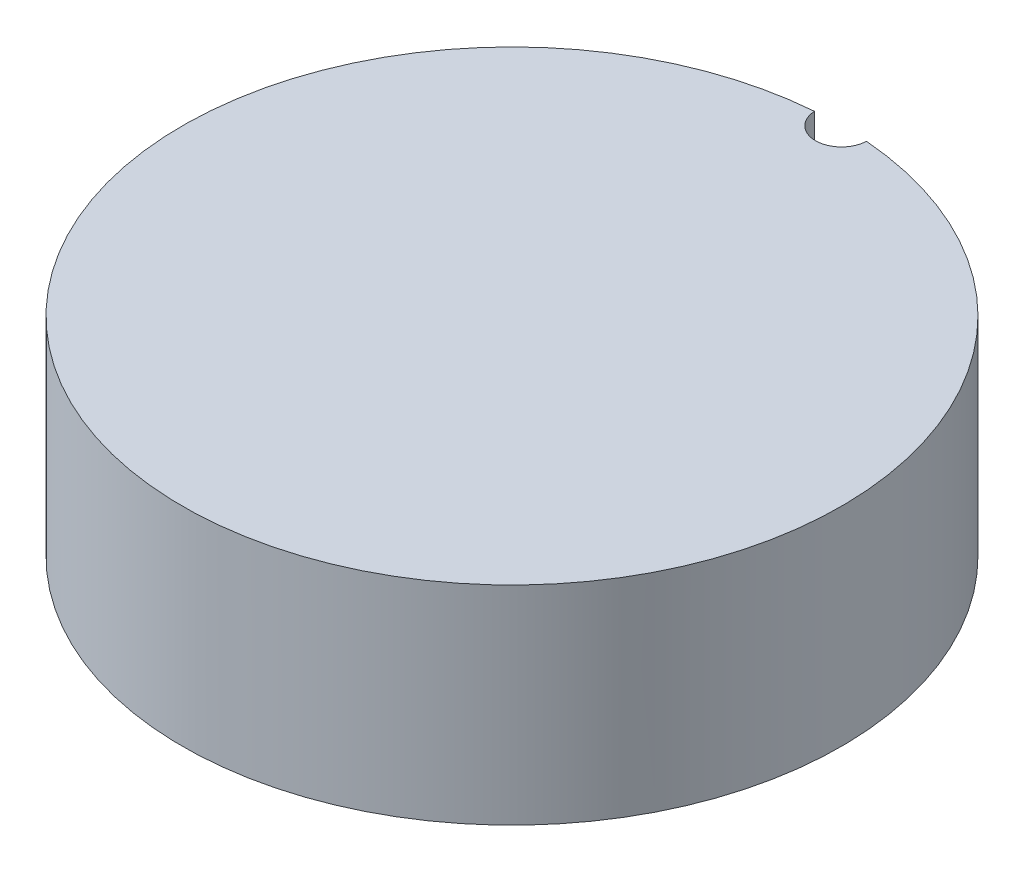
ISO-10303-21;
HEADER;
FILE_DESCRIPTION(('STEP AP214'),'2;1');
FILE_NAME('part.step','',(''),(''),'','','');
FILE_SCHEMA(('AUTOMOTIVE_DESIGN { 1 0 10303 214 1 1 1 1 }'));
ENDSEC;
DATA;
#1=APPLICATION_CONTEXT('core data for automotive mechanical design processes');
#2=APPLICATION_PROTOCOL_DEFINITION('international standard','automotive_design',2000,#1);
#3=PRODUCT_CONTEXT('',#1,'mechanical');
#4=PRODUCT('Part','Part','',(#3));
#5=PRODUCT_RELATED_PRODUCT_CATEGORY('part','',(#4));
#6=PRODUCT_DEFINITION_FORMATION('','',#4);
#7=PRODUCT_DEFINITION_CONTEXT('part definition',#1,'design');
#8=PRODUCT_DEFINITION('design','',#6,#7);
#9=PRODUCT_DEFINITION_SHAPE('','',#8);
#10=(LENGTH_UNIT() NAMED_UNIT(*) SI_UNIT(.MILLI.,.METRE.));
#11=(NAMED_UNIT(*) PLANE_ANGLE_UNIT() SI_UNIT($,.RADIAN.));
#12=(NAMED_UNIT(*) SI_UNIT($,.STERADIAN.) SOLID_ANGLE_UNIT());
#13=UNCERTAINTY_MEASURE_WITH_UNIT(LENGTH_MEASURE(1.E-05),#10,'distance_accuracy_value','');
#14=(GEOMETRIC_REPRESENTATION_CONTEXT(3) GLOBAL_UNCERTAINTY_ASSIGNED_CONTEXT((#13)) GLOBAL_UNIT_ASSIGNED_CONTEXT((#10,
#11,#12)) REPRESENTATION_CONTEXT('',''));
#15=CARTESIAN_POINT('',(0.,0.,0.));
#16=DIRECTION('',(0.,0.,1.));
#17=DIRECTION('',(1.,0.,0.));
#18=AXIS2_PLACEMENT_3D('',#15,#16,#17);
#19=CARTESIAN_POINT('',(-31.685,0.,0.));
#20=DIRECTION('',(0.,1.,0.));
#21=DIRECTION('',(-1.,0.,0.));
#22=AXIS2_PLACEMENT_3D('',#19,#20,#21);
#23=PLANE('',#22);
#24=CARTESIAN_POINT('',(0.,0.,-31.685));
#25=DIRECTION('',(0.,1.,0.));
#26=DIRECTION('',(-1.,0.,0.));
#27=AXIS2_PLACEMENT_3D('',#24,#25,#26);
#28=CIRCLE('',#27,2.5);
#29=CARTESIAN_POINT('',(-2.49805378105651,0.,-31.5863728893798));
#30=VERTEX_POINT('',#29);
#31=CARTESIAN_POINT('',(2.49805378105651,0.,-31.5863728893798));
#32=VERTEX_POINT('',#31);
#33=EDGE_CURVE('E87',#30,#32,#28,.T.);
#34=ORIENTED_EDGE('',*,*,#33,.F.);
#35=CARTESIAN_POINT('',(0.,0.,0.));
#36=DIRECTION('',(0.,1.,0.));
#37=DIRECTION('',(-1.,0.,0.));
#38=AXIS2_PLACEMENT_3D('',#35,#36,#37);
#39=CIRCLE('',#38,31.685);
#40=EDGE_CURVE('E52',#30,#32,#39,.T.);
#41=ORIENTED_EDGE('',*,*,#40,.T.);
#42=EDGE_LOOP('',(#34,#41));
#43=FACE_BOUND('',#42,.T.);
#44=ADVANCED_FACE('F38',(#43),#23,.T.);
#45=CARTESIAN_POINT('',(0.,0.,0.));
#46=DIRECTION('',(0.,1.,0.));
#47=DIRECTION('',(-1.,0.,0.));
#48=AXIS2_PLACEMENT_3D('',#45,#46,#47);
#49=CYLINDRICAL_SURFACE('',#48,31.685);
#50=DIRECTION('',(0.,1.,0.));
#51=VECTOR('',#50,1.);
#52=CARTESIAN_POINT('',(-2.49805378105651,-20.,-31.5863728893798));
#53=LINE('',#52,#51);
#54=CARTESIAN_POINT('',(-2.49805378105651,-20.,-31.5863728893798));
#55=VERTEX_POINT('',#54);
#56=EDGE_CURVE('E63',#55,#30,#53,.T.);
#57=ORIENTED_EDGE('',*,*,#56,.F.);
#58=CARTESIAN_POINT('',(0.,-20.,0.));
#59=DIRECTION('',(0.,1.,0.));
#60=DIRECTION('',(-1.,0.,0.));
#61=AXIS2_PLACEMENT_3D('',#58,#59,#60);
#62=CIRCLE('',#61,31.685);
#63=CARTESIAN_POINT('',(2.49805378105651,-20.,-31.5863728893798));
#64=VERTEX_POINT('',#63);
#65=EDGE_CURVE('E75',#55,#64,#62,.T.);
#66=ORIENTED_EDGE('',*,*,#65,.T.);
#67=DIRECTION('',(0.,1.,0.));
#68=VECTOR('',#67,1.);
#69=CARTESIAN_POINT('',(2.49805378105651,-20.,-31.5863728893798));
#70=LINE('',#69,#68);
#71=EDGE_CURVE('E58',#64,#32,#70,.T.);
#72=ORIENTED_EDGE('',*,*,#71,.T.);
#73=ORIENTED_EDGE('',*,*,#40,.F.);
#74=EDGE_LOOP('',(#57,#66,#72,#73));
#75=FACE_BOUND('',#74,.T.);
#76=ADVANCED_FACE('F74',(#75),#49,.T.);
#77=CARTESIAN_POINT('',(0.,-20.,0.));
#78=DIRECTION('',(0.,1.,0.));
#79=DIRECTION('',(-1.,0.,0.));
#80=AXIS2_PLACEMENT_3D('',#77,#78,#79);
#81=TOROIDAL_SURFACE('',#80,21.685,10.);
#82=CARTESIAN_POINT('',(2.49805378097755,-20.0002,-31.5863728873798));
#83=CARTESIAN_POINT('',(2.49803226030124,-19.8609735334104,-31.5863792021508));
#84=CARTESIAN_POINT('',(2.49793846335794,-19.7217473724363,-31.5834709830961));
#85=CARTESIAN_POINT('',(2.49745073847929,-19.4435366054167,-31.57185082952));
#86=CARTESIAN_POINT('',(2.49705680768542,-19.3045520016844,-31.5631388397228));
#87=CARTESIAN_POINT('',(2.49581240813705,-19.026884316439,-31.5399211424883));
#88=CARTESIAN_POINT('',(2.49496133580313,-18.8882018775043,-31.525407781801));
#89=CARTESIAN_POINT('',(2.49249456523227,-18.6115670080552,-31.4906379339553));
#90=CARTESIAN_POINT('',(2.49087887531485,-18.4736145696145,-31.4703815092861));
#91=CARTESIAN_POINT('',(2.48645241483846,-18.1977742458198,-31.4240417405312));
#92=CARTESIAN_POINT('',(2.48363383276224,-18.0598927866746,-31.3979208478406));
#93=CARTESIAN_POINT('',(2.47625564376228,-17.7853702714661,-31.3400218915293));
#94=CARTESIAN_POINT('',(2.47169606529032,-17.6487291951696,-31.3082439203625));
#95=CARTESIAN_POINT('',(2.46017611889462,-17.3770662129406,-31.2391767464367));
#96=CARTESIAN_POINT('',(2.45321773410301,-17.2420430645542,-31.2018921106344));
#97=CARTESIAN_POINT('',(2.43611268679312,-16.9738183365467,-31.1219491847869));
#98=CARTESIAN_POINT('',(2.42596652709255,-16.840616473104,-31.0792917428464));
#99=CARTESIAN_POINT('',(2.40196186054151,-16.5806905909418,-30.9902814662674));
#100=CARTESIAN_POINT('',(2.38823596404355,-16.4538973665585,-30.9440956288559));
#101=CARTESIAN_POINT('',(2.35596553118701,-16.2026986513739,-30.8471225076173));
#102=CARTESIAN_POINT('',(2.33742118962567,-16.0782930642649,-30.7963354098614));
#103=CARTESIAN_POINT('',(2.29441980940415,-15.8325145140031,-30.6905690101038));
#104=CARTESIAN_POINT('',(2.2699711272399,-15.7111375299491,-30.6355957075246));
#105=CARTESIAN_POINT('',(2.2138556683929,-15.471863179446,-30.5218724247385));
#106=CARTESIAN_POINT('',(2.18219030667878,-15.3539651359953,-30.4631231864954));
#107=CARTESIAN_POINT('',(2.11797969824251,-15.1476325417017,-30.3556470743587));
#108=CARTESIAN_POINT('',(2.08712150509533,-15.0583635857737,-30.3075171146024));
#109=CARTESIAN_POINT('',(2.01926984804769,-14.8829969870804,-30.2098437469504));
#110=CARTESIAN_POINT('',(1.9822781250606,-14.7968984528873,-30.1603007434212));
#111=CARTESIAN_POINT('',(1.90134231730026,-14.6286465689373,-30.0604942347369));
#112=CARTESIAN_POINT('',(1.85740930778571,-14.5464872016707,-30.0102319914279));
#113=CARTESIAN_POINT('',(1.76166630674593,-14.386884679568,-29.9097981972028));
#114=CARTESIAN_POINT('',(1.70986090087493,-14.3094388156699,-29.8596266105842));
#115=CARTESIAN_POINT('',(1.58407948528535,-14.1425793361201,-29.7486880528535));
#116=CARTESIAN_POINT('',(1.50775976909086,-14.0546883720746,-29.6882328355888));
#117=CARTESIAN_POINT('',(1.34025698538834,-13.8905723472295,-29.5721685658388));
#118=CARTESIAN_POINT('',(1.2490920242042,-13.814333291811,-29.5165537349055));
#119=CARTESIAN_POINT('',(1.07024824096102,-13.6900863286462,-29.4238740790618));
#120=CARTESIAN_POINT('',(0.985190756525878,-13.6394665623496,-29.3852918415038));
#121=CARTESIAN_POINT('',(0.805739849160802,-13.5504123061236,-29.3164571384813));
#122=CARTESIAN_POINT('',(0.711350918003101,-13.5119719906202,-29.286200691607));
#123=CARTESIAN_POINT('',(0.514278108405212,-13.4491874026604,-29.2363428644089));
#124=CARTESIAN_POINT('',(0.411529534279399,-13.4249679522603,-29.2168359256963));
#125=CARTESIAN_POINT('',(0.201903652750457,-13.3929039367367,-29.1909367740654));
#126=CARTESIAN_POINT('',(0.0950298762282112,-13.3850456708431,-29.1845335882101));
#127=CARTESIAN_POINT('',(-0.103354951144214,-13.3861790582397,-29.1854514254085));
#128=CARTESIAN_POINT('',(-0.194898807773608,-13.3929426424962,-29.1909577460333));
#129=CARTESIAN_POINT('',(-0.375135197781278,-13.4185286693978,-29.2116424076121));
#130=CARTESIAN_POINT('',(-0.463827980825762,-13.4373500531136,-29.2268198992324));
#131=CARTESIAN_POINT('',(-0.635187942478309,-13.485787183826,-29.265458845625));
#132=CARTESIAN_POINT('',(-0.717909377844674,-13.5152854465021,-29.2888300551968));
#133=CARTESIAN_POINT('',(-0.876938096994406,-13.5837794510856,-29.3423450331247));
#134=CARTESIAN_POINT('',(-0.953242596178181,-13.6227792878407,-29.3724917210409));
#135=CARTESIAN_POINT('',(-1.13207103307728,-13.7286633646344,-29.4529729346678));
#136=CARTESIAN_POINT('',(-1.23056897827665,-13.800132762791,-29.5062249368826));
#137=CARTESIAN_POINT('',(-1.41209359277515,-13.9563893012054,-29.6192097393419));
#138=CARTESIAN_POINT('',(-1.49508619177858,-14.0412050320825,-29.67895636545));
#139=CARTESIAN_POINT('',(-1.62755188251281,-14.1982395209452,-29.7859525720525));
#140=CARTESIAN_POINT('',(-1.68020711429466,-14.26826694789,-29.8325691547956));
#141=CARTESIAN_POINT('',(-1.77817106697344,-14.4129594910531,-29.9263893945578));
#142=CARTESIAN_POINT('',(-1.82347599345972,-14.4876269752529,-29.9735933413372));
#143=CARTESIAN_POINT('',(-1.90750217297698,-14.6408180017512,-30.0677730158634));
#144=CARTESIAN_POINT('',(-1.94621615758022,-14.7193456796587,-30.1147484368643));
#145=CARTESIAN_POINT('',(-2.01775870160314,-14.8795615543167,-30.207809469605));
#146=CARTESIAN_POINT('',(-2.0505851007912,-14.9612508978119,-30.2538947492287));
#147=CARTESIAN_POINT('',(-2.13305384746785,-15.1876710742042,-30.3777189011972));
#148=CARTESIAN_POINT('',(-2.17755606998157,-15.3350297237178,-30.4540946678933));
#149=CARTESIAN_POINT('',(-2.25431839605891,-15.6357131178851,-30.6010643642537));
#150=CARTESIAN_POINT('',(-2.28656951090012,-15.7890421524656,-30.6716540189432));
#151=CARTESIAN_POINT('',(-2.34162665003919,-16.1010194130889,-30.8063099417017));
#152=CARTESIAN_POINT('',(-2.36438837758303,-16.2596889298857,-30.8703445856113));
#153=CARTESIAN_POINT('',(-2.40252638861572,-16.5806923878543,-30.9908401132305));
#154=CARTESIAN_POINT('',(-2.41790375332948,-16.7430257889103,-31.0473021048614));
#155=CARTESIAN_POINT('',(-2.44019435357374,-17.0321348445551,-31.1398849605476));
#156=CARTESIAN_POINT('',(-2.4482475912391,-17.1582968643496,-31.1776671390509));
#157=CARTESIAN_POINT('',(-2.46184519010346,-17.4120997545832,-31.2484107891441));
#158=CARTESIAN_POINT('',(-2.46738933118803,-17.5397407537611,-31.2813718376212));
#159=CARTESIAN_POINT('',(-2.48121621048472,-17.9246656127714,-31.3728725234045));
#160=CARTESIAN_POINT('',(-2.48668805070618,-18.1838707528556,-31.4240038292274));
#161=CARTESIAN_POINT('',(-2.49207123044114,-18.5732566988791,-31.4850840360934));
#162=CARTESIAN_POINT('',(-2.49339520752282,-18.7022740959816,-31.5027731203254));
#163=CARTESIAN_POINT('',(-2.49543053002259,-18.9609148137259,-31.5331344365859));
#164=CARTESIAN_POINT('',(-2.49614187314225,-19.0905381366391,-31.5458066497925));
#165=CARTESIAN_POINT('',(-2.49719158876498,-19.3500688923529,-31.5660830417551));
#166=CARTESIAN_POINT('',(-2.4975302760414,-19.4799759923625,-31.5736914955959));
#167=CARTESIAN_POINT('',(-2.49795335204139,-19.7399881839121,-31.5838389244066));
#168=CARTESIAN_POINT('',(-2.49803774122339,-19.8700932750947,-31.5863779085157));
#169=CARTESIAN_POINT('',(-2.49805378097754,-20.0002,-31.5863728873798));
#170=B_SPLINE_CURVE_WITH_KNOTS('',3,(#82,#83,#84,#85,#86,#87,#88,#89,#90,#91,#92,#93,#94,#95,
#96,#97,#98,#99,#100,#101,#102,#103,#104,#105,#106,#107,#108,#109,#110,#111,#112,#113,#114,#115,
#116,#117,#118,#119,#120,#121,#122,#123,#124,#125,#126,#127,#128,#129,#130,#131,#132,#133,#134,
#135,#136,#137,#138,#139,#140,#141,#142,#143,#144,#145,#146,#147,#148,#149,#150,#151,#152,#153,
#154,#155,#156,#157,#158,#159,#160,#161,#162,#163,#164,#165,#166,#167,#168,#169),.UNSPECIFIED.,
.F.,.F.,(4,2,2,2,2,2,2,2,2,2,2,2,2,2,2,2,2,2,2,2,2,2,2,2,2,2,2,2,2,2,2,2,2,2,2,2,2,2,2,2,2,2,2,
4),(0.,0.417648376680758,0.835300731151119,1.25350588651525,1.67170649164219,2.09266521287002,
2.5136170549837,2.93422172064361,3.35476007629333,3.76151152497876,4.16824653231447,
4.57440922123081,4.98049234255895,5.29831589005351,5.6160493818904,5.93328093656937,
6.25032840789088,6.64263071493011,7.03445807732763,7.35193075209536,7.66925134592183,
7.98931708713645,8.30911469900246,8.58363589849956,8.85813299254479,9.12969714088673,
9.40137853159393,9.7976674430002,10.1948171440743,10.4921539535682,10.7896437706695,
11.0874595609628,11.3853844011893,11.9000510108615,12.4150945089599,12.932516030765,
13.4498617681364,13.8455697830762,14.2413125053976,15.0330516025408,15.4236731161119,
15.8142960951697,16.2045888705628,16.5948809423373),.UNSPECIFIED.);
#171=EDGE_CURVE('E11',#64,#55,#170,.T.);
#172=ORIENTED_EDGE('',*,*,#171,.F.);
#173=ORIENTED_EDGE('',*,*,#65,.F.);
#174=EDGE_LOOP('',(#172,#173));
#175=FACE_BOUND('',#174,.T.);
#176=CARTESIAN_POINT('',(0.,-10.,0.));
#177=DIRECTION('',(0.,1.,0.));
#178=DIRECTION('',(-1.,0.,0.));
#179=AXIS2_PLACEMENT_3D('',#176,#177,#178);
#180=CIRCLE('',#179,21.685);
#181=CARTESIAN_POINT('',(-21.685,-10.,0.));
#182=VERTEX_POINT('',#181);
#183=EDGE_CURVE('E82',#182,#182,#180,.T.);
#184=ORIENTED_EDGE('',*,*,#183,.T.);
#185=EDGE_LOOP('',(#184));
#186=FACE_BOUND('',#185,.T.);
#187=ADVANCED_FACE('F79',(#175,#186),#81,.F.);
#188=CARTESIAN_POINT('',(0.,-10.,0.));
#189=DIRECTION('',(0.,-1.,0.));
#190=DIRECTION('',(1.,0.,0.));
#191=AXIS2_PLACEMENT_3D('',#188,#189,#190);
#192=PLANE('',#191);
#193=ORIENTED_EDGE('',*,*,#183,.F.);
#194=EDGE_LOOP('',(#193));
#195=FACE_BOUND('',#194,.T.);
#196=ADVANCED_FACE('F101',(#195),#192,.T.);
#197=CARTESIAN_POINT('',(0.,-20.,-31.685));
#198=DIRECTION('',(0.,1.,0.));
#199=DIRECTION('',(-1.,0.,0.));
#200=AXIS2_PLACEMENT_3D('',#197,#198,#199);
#201=CYLINDRICAL_SURFACE('',#200,2.5);
#202=ORIENTED_EDGE('',*,*,#33,.T.);
#203=ORIENTED_EDGE('',*,*,#71,.F.);
#204=ORIENTED_EDGE('',*,*,#171,.T.);
#205=ORIENTED_EDGE('',*,*,#56,.T.);
#206=EDGE_LOOP('',(#202,#203,#204,#205));
#207=FACE_BOUND('',#206,.T.);
#208=ADVANCED_FACE('F68',(#207),#201,.F.);
#209=CLOSED_SHELL('',(#44,#76,#187,#196,#208));
#210=MANIFOLD_SOLID_BREP('B2',#209);
#211=ADVANCED_BREP_SHAPE_REPRESENTATION('',(#18,#210),#14);
#212=SHAPE_DEFINITION_REPRESENTATION(#9,#211);
ENDSEC;
END-ISO-10303-21;
